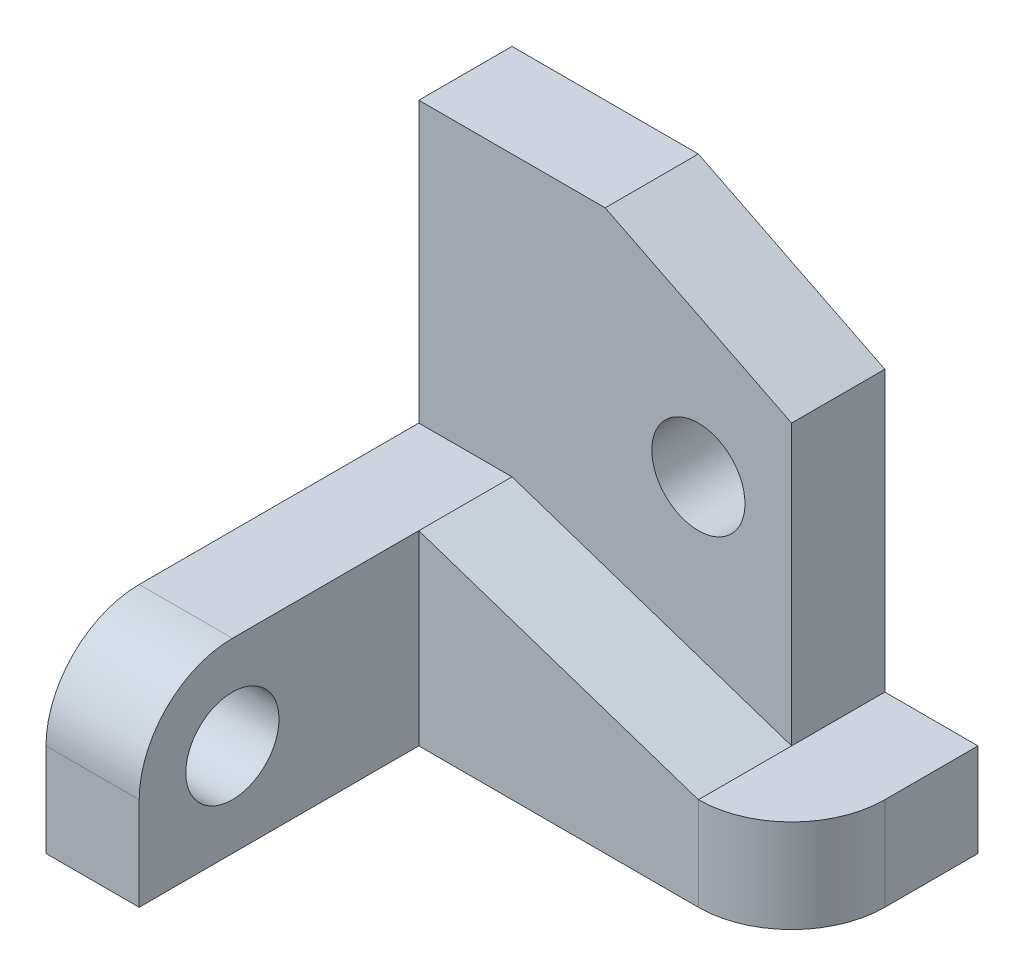
ISO-10303-21;
HEADER;
FILE_DESCRIPTION(('STEP AP214'),'2;1');
FILE_NAME('part.step','',(''),(''),'','','');
FILE_SCHEMA(('AUTOMOTIVE_DESIGN { 1 0 10303 214 1 1 1 1 }'));
ENDSEC;
DATA;
#1=APPLICATION_CONTEXT('core data for automotive mechanical design processes');
#2=APPLICATION_PROTOCOL_DEFINITION('international standard','automotive_design',2000,#1);
#3=PRODUCT_CONTEXT('',#1,'mechanical');
#4=PRODUCT('Part','Part','',(#3));
#5=PRODUCT_RELATED_PRODUCT_CATEGORY('part','',(#4));
#6=PRODUCT_DEFINITION_FORMATION('','',#4);
#7=PRODUCT_DEFINITION_CONTEXT('part definition',#1,'design');
#8=PRODUCT_DEFINITION('design','',#6,#7);
#9=PRODUCT_DEFINITION_SHAPE('','',#8);
#10=(LENGTH_UNIT() NAMED_UNIT(*) SI_UNIT(.MILLI.,.METRE.));
#11=(NAMED_UNIT(*) PLANE_ANGLE_UNIT() SI_UNIT($,.RADIAN.));
#12=(NAMED_UNIT(*) SI_UNIT($,.STERADIAN.) SOLID_ANGLE_UNIT());
#13=UNCERTAINTY_MEASURE_WITH_UNIT(LENGTH_MEASURE(1.E-05),#10,'distance_accuracy_value','');
#14=(GEOMETRIC_REPRESENTATION_CONTEXT(3) GLOBAL_UNCERTAINTY_ASSIGNED_CONTEXT((#13)) GLOBAL_UNIT_ASSIGNED_CONTEXT((#10,
#11,#12)) REPRESENTATION_CONTEXT('',''));
#15=CARTESIAN_POINT('',(0.,0.,0.));
#16=DIRECTION('',(0.,0.,1.));
#17=DIRECTION('',(1.,0.,0.));
#18=AXIS2_PLACEMENT_3D('',#15,#16,#17);
#19=CARTESIAN_POINT('',(0.,0.,5.));
#20=DIRECTION('',(-1.,0.,0.));
#21=DIRECTION('',(0.,-1.,0.));
#22=AXIS2_PLACEMENT_3D('',#19,#20,#21);
#23=PLANE('',#22);
#24=DIRECTION('',(0.,0.,1.));
#25=VECTOR('',#24,1.);
#26=CARTESIAN_POINT('',(0.,5.,-7.07106781186548));
#27=LINE('',#26,#25);
#28=CARTESIAN_POINT('',(0.,5.,0.));
#29=VERTEX_POINT('',#28);
#30=CARTESIAN_POINT('',(0.,5.,5.));
#31=VERTEX_POINT('',#30);
#32=EDGE_CURVE('E123',#29,#31,#27,.T.);
#33=ORIENTED_EDGE('',*,*,#32,.F.);
#34=DIRECTION('',(0.,1.,0.));
#35=VECTOR('',#34,1.);
#36=CARTESIAN_POINT('',(0.,0.,0.));
#37=LINE('',#36,#35);
#38=CARTESIAN_POINT('',(0.,20.0000000000001,0.));
#39=VERTEX_POINT('',#38);
#40=EDGE_CURVE('E172',#29,#39,#37,.T.);
#41=ORIENTED_EDGE('',*,*,#40,.T.);
#42=DIRECTION('',(0.,0.,-1.));
#43=VECTOR('',#42,1.);
#44=CARTESIAN_POINT('',(0.,20.0000000000001,5.));
#45=LINE('',#44,#43);
#46=CARTESIAN_POINT('',(0.,20.0000000000001,5.));
#47=VERTEX_POINT('',#46);
#48=EDGE_CURVE('E153',#47,#39,#45,.T.);
#49=ORIENTED_EDGE('',*,*,#48,.F.);
#50=DIRECTION('',(0.,1.,0.));
#51=VECTOR('',#50,1.);
#52=CARTESIAN_POINT('',(0.,0.,5.));
#53=LINE('',#52,#51);
#54=EDGE_CURVE('E141',#31,#47,#53,.T.);
#55=ORIENTED_EDGE('',*,*,#54,.F.);
#56=EDGE_LOOP('',(#33,#41,#49,#55));
#57=FACE_BOUND('',#56,.T.);
#58=ADVANCED_FACE('F35',(#57),#23,.F.);
#59=CARTESIAN_POINT('',(0.,0.,5.));
#60=DIRECTION('',(0.,0.,1.));
#61=DIRECTION('',(1.,0.,0.));
#62=AXIS2_PLACEMENT_3D('',#59,#60,#61);
#63=PLANE('',#62);
#64=DIRECTION('',(-1.,0.,0.));
#65=VECTOR('',#64,1.);
#66=CARTESIAN_POINT('',(7.3606797749979,10.,5.));
#67=LINE('',#66,#65);
#68=CARTESIAN_POINT('',(-15.,10.,5.));
#69=VERTEX_POINT('',#68);
#70=CARTESIAN_POINT('',(-20.,10.,5.));
#71=VERTEX_POINT('',#70);
#72=EDGE_CURVE('E145',#69,#71,#67,.T.);
#73=ORIENTED_EDGE('',*,*,#72,.F.);
#74=DIRECTION('',(-0.948683298050514,0.316227766016838,0.));
#75=VECTOR('',#74,1.);
#76=CARTESIAN_POINT('',(-15.,10.,5.));
#77=LINE('',#76,#75);
#78=EDGE_CURVE('E138',#31,#69,#77,.T.);
#79=ORIENTED_EDGE('',*,*,#78,.F.);
#80=ORIENTED_EDGE('',*,*,#54,.T.);
#81=DIRECTION('',(-0.89442719099992,0.447213595499949,0.));
#82=VECTOR('',#81,1.);
#83=CARTESIAN_POINT('',(-10.,25.,5.));
#84=LINE('',#83,#82);
#85=CARTESIAN_POINT('',(-10.,25.,5.));
#86=VERTEX_POINT('',#85);
#87=EDGE_CURVE('E154',#47,#86,#84,.T.);
#88=ORIENTED_EDGE('',*,*,#87,.T.);
#89=DIRECTION('',(-1.,0.,0.));
#90=VECTOR('',#89,1.);
#91=CARTESIAN_POINT('',(-10.,25.,5.));
#92=LINE('',#91,#90);
#93=CARTESIAN_POINT('',(-20.,25.,5.));
#94=VERTEX_POINT('',#93);
#95=EDGE_CURVE('E176',#86,#94,#92,.T.);
#96=ORIENTED_EDGE('',*,*,#95,.T.);
#97=DIRECTION('',(0.,-1.,0.));
#98=VECTOR('',#97,1.);
#99=CARTESIAN_POINT('',(-20.,0.,5.));
#100=LINE('',#99,#98);
#101=EDGE_CURVE('E178',#94,#71,#100,.T.);
#102=ORIENTED_EDGE('',*,*,#101,.T.);
#103=EDGE_LOOP('',(#73,#79,#80,#88,#96,#102));
#104=FACE_BOUND('',#103,.T.);
#105=CARTESIAN_POINT('',(-5.,15.,5.));
#106=DIRECTION('',(0.,0.,1.));
#107=DIRECTION('',(1.,0.,0.));
#108=AXIS2_PLACEMENT_3D('',#105,#106,#107);
#109=CIRCLE('',#108,2.5);
#110=CARTESIAN_POINT('',(-2.5,15.,5.));
#111=VERTEX_POINT('',#110);
#112=EDGE_CURVE('E169',#111,#111,#109,.T.);
#113=ORIENTED_EDGE('',*,*,#112,.F.);
#114=EDGE_LOOP('',(#113));
#115=FACE_BOUND('',#114,.T.);
#116=ADVANCED_FACE('F139',(#104,#115),#63,.T.);
#117=CARTESIAN_POINT('',(0.,0.,0.));
#118=DIRECTION('',(0.,0.,1.));
#119=DIRECTION('',(1.,0.,0.));
#120=AXIS2_PLACEMENT_3D('',#117,#118,#119);
#121=PLANE('',#120);
#122=ORIENTED_EDGE('',*,*,#40,.F.);
#123=DIRECTION('',(-1.,0.,0.));
#124=VECTOR('',#123,1.);
#125=CARTESIAN_POINT('',(0.,5.,0.));
#126=LINE('',#125,#124);
#127=CARTESIAN_POINT('',(5.,5.,0.));
#128=VERTEX_POINT('',#127);
#129=EDGE_CURVE('E130',#128,#29,#126,.T.);
#130=ORIENTED_EDGE('',*,*,#129,.F.);
#131=DIRECTION('',(0.,1.,0.));
#132=VECTOR('',#131,1.);
#133=CARTESIAN_POINT('',(5.,5.,0.));
#134=LINE('',#133,#132);
#135=CARTESIAN_POINT('',(5.,0.,0.));
#136=VERTEX_POINT('',#135);
#137=EDGE_CURVE('E226',#136,#128,#134,.T.);
#138=ORIENTED_EDGE('',*,*,#137,.F.);
#139=DIRECTION('',(1.,0.,0.));
#140=VECTOR('',#139,1.);
#141=CARTESIAN_POINT('',(0.,0.,0.));
#142=LINE('',#141,#140);
#143=CARTESIAN_POINT('',(-20.,0.,0.));
#144=VERTEX_POINT('',#143);
#145=EDGE_CURVE('E155',#144,#136,#142,.T.);
#146=ORIENTED_EDGE('',*,*,#145,.F.);
#147=DIRECTION('',(0.,-1.,0.));
#148=VECTOR('',#147,1.);
#149=CARTESIAN_POINT('',(-20.,0.,0.));
#150=LINE('',#149,#148);
#151=CARTESIAN_POINT('',(-20.,25.,0.));
#152=VERTEX_POINT('',#151);
#153=EDGE_CURVE('E186',#152,#144,#150,.T.);
#154=ORIENTED_EDGE('',*,*,#153,.F.);
#155=DIRECTION('',(-1.,0.,0.));
#156=VECTOR('',#155,1.);
#157=CARTESIAN_POINT('',(-10.,25.,0.));
#158=LINE('',#157,#156);
#159=CARTESIAN_POINT('',(-10.,25.,0.));
#160=VERTEX_POINT('',#159);
#161=EDGE_CURVE('E184',#160,#152,#158,.T.);
#162=ORIENTED_EDGE('',*,*,#161,.F.);
#163=DIRECTION('',(-0.89442719099992,0.447213595499949,0.));
#164=VECTOR('',#163,1.);
#165=CARTESIAN_POINT('',(-10.,25.,0.));
#166=LINE('',#165,#164);
#167=EDGE_CURVE('E182',#39,#160,#166,.T.);
#168=ORIENTED_EDGE('',*,*,#167,.F.);
#169=EDGE_LOOP('',(#122,#130,#138,#146,#154,#162,#168));
#170=FACE_BOUND('',#169,.T.);
#171=CARTESIAN_POINT('',(-5.,15.,0.));
#172=DIRECTION('',(0.,0.,1.));
#173=DIRECTION('',(1.,0.,0.));
#174=AXIS2_PLACEMENT_3D('',#171,#172,#173);
#175=CIRCLE('',#174,2.5);
#176=CARTESIAN_POINT('',(-2.5,15.,0.));
#177=VERTEX_POINT('',#176);
#178=EDGE_CURVE('E168',#177,#177,#175,.T.);
#179=ORIENTED_EDGE('',*,*,#178,.T.);
#180=EDGE_LOOP('',(#179));
#181=FACE_BOUND('',#180,.T.);
#182=ADVANCED_FACE('F273',(#170,#181),#121,.F.);
#183=CARTESIAN_POINT('',(-10.,25.,5.));
#184=DIRECTION('',(-0.447213595499949,-0.89442719099992,0.));
#185=DIRECTION('',(0.89442719099992,-0.447213595499949,0.));
#186=AXIS2_PLACEMENT_3D('',#183,#184,#185);
#187=PLANE('',#186);
#188=ORIENTED_EDGE('',*,*,#167,.T.);
#189=DIRECTION('',(0.,0.,-1.));
#190=VECTOR('',#189,1.);
#191=CARTESIAN_POINT('',(-10.,25.,5.));
#192=LINE('',#191,#190);
#193=EDGE_CURVE('E195',#86,#160,#192,.T.);
#194=ORIENTED_EDGE('',*,*,#193,.F.);
#195=ORIENTED_EDGE('',*,*,#87,.F.);
#196=ORIENTED_EDGE('',*,*,#48,.T.);
#197=EDGE_LOOP('',(#188,#194,#195,#196));
#198=FACE_BOUND('',#197,.T.);
#199=ADVANCED_FACE('F281',(#198),#187,.F.);
#200=CARTESIAN_POINT('',(-10.,25.,5.));
#201=DIRECTION('',(0.,-1.,0.));
#202=DIRECTION('',(1.,0.,0.));
#203=AXIS2_PLACEMENT_3D('',#200,#201,#202);
#204=PLANE('',#203);
#205=ORIENTED_EDGE('',*,*,#161,.T.);
#206=DIRECTION('',(0.,0.,-1.));
#207=VECTOR('',#206,1.);
#208=CARTESIAN_POINT('',(-20.,25.,5.));
#209=LINE('',#208,#207);
#210=EDGE_CURVE('E192',#94,#152,#209,.T.);
#211=ORIENTED_EDGE('',*,*,#210,.F.);
#212=ORIENTED_EDGE('',*,*,#95,.F.);
#213=ORIENTED_EDGE('',*,*,#193,.T.);
#214=EDGE_LOOP('',(#205,#211,#212,#213));
#215=FACE_BOUND('',#214,.T.);
#216=ADVANCED_FACE('F277',(#215),#204,.F.);
#217=CARTESIAN_POINT('',(-20.,0.,5.));
#218=DIRECTION('',(1.,0.,0.));
#219=DIRECTION('',(0.,0.,-1.));
#220=AXIS2_PLACEMENT_3D('',#217,#218,#219);
#221=PLANE('',#220);
#222=DIRECTION('',(0.,1.,0.));
#223=VECTOR('',#222,1.);
#224=CARTESIAN_POINT('',(-20.,0.,25.));
#225=LINE('',#224,#223);
#226=CARTESIAN_POINT('',(-20.,0.,25.));
#227=VERTEX_POINT('',#226);
#228=CARTESIAN_POINT('',(-20.,5.,25.));
#229=VERTEX_POINT('',#228);
#230=EDGE_CURVE('E235',#227,#229,#225,.T.);
#231=ORIENTED_EDGE('',*,*,#230,.T.);
#232=CARTESIAN_POINT('',(-20.,5.,20.));
#233=DIRECTION('',(1.,0.,0.));
#234=DIRECTION('',(0.,0.,-1.));
#235=AXIS2_PLACEMENT_3D('',#232,#233,#234);
#236=CIRCLE('',#235,5.);
#237=CARTESIAN_POINT('',(-20.,10.,20.));
#238=VERTEX_POINT('',#237);
#239=EDGE_CURVE('E202',#229,#238,#236,.F.);
#240=ORIENTED_EDGE('',*,*,#239,.T.);
#241=DIRECTION('',(0.,0.,-1.));
#242=VECTOR('',#241,1.);
#243=CARTESIAN_POINT('',(-20.,10.,5.));
#244=LINE('',#243,#242);
#245=EDGE_CURVE('E233',#238,#71,#244,.T.);
#246=ORIENTED_EDGE('',*,*,#245,.T.);
#247=ORIENTED_EDGE('',*,*,#101,.F.);
#248=ORIENTED_EDGE('',*,*,#210,.T.);
#249=ORIENTED_EDGE('',*,*,#153,.T.);
#250=DIRECTION('',(0.,0.,-1.));
#251=VECTOR('',#250,1.);
#252=CARTESIAN_POINT('',(-20.,0.,5.));
#253=LINE('',#252,#251);
#254=EDGE_CURVE('E180',#227,#144,#253,.T.);
#255=ORIENTED_EDGE('',*,*,#254,.F.);
#256=EDGE_LOOP('',(#231,#240,#246,#247,#248,#249,#255));
#257=FACE_BOUND('',#256,.T.);
#258=CARTESIAN_POINT('',(-20.,5.,20.));
#259=DIRECTION('',(-1.,0.,0.));
#260=DIRECTION('',(0.,0.,1.));
#261=AXIS2_PLACEMENT_3D('',#258,#259,#260);
#262=CIRCLE('',#261,2.5);
#263=CARTESIAN_POINT('',(-20.,5.,22.5));
#264=VERTEX_POINT('',#263);
#265=EDGE_CURVE('E238',#264,#264,#262,.T.);
#266=ORIENTED_EDGE('',*,*,#265,.F.);
#267=EDGE_LOOP('',(#266));
#268=FACE_BOUND('',#267,.T.);
#269=ADVANCED_FACE('F266',(#257,#268),#221,.F.);
#270=CARTESIAN_POINT('',(0.,0.,5.));
#271=DIRECTION('',(0.,1.,0.));
#272=DIRECTION('',(-1.,0.,0.));
#273=AXIS2_PLACEMENT_3D('',#270,#271,#272);
#274=PLANE('',#273);
#275=DIRECTION('',(0.,0.,-1.));
#276=VECTOR('',#275,1.);
#277=CARTESIAN_POINT('',(5.,0.,10.));
#278=LINE('',#277,#276);
#279=CARTESIAN_POINT('',(5.,0.,5.));
#280=VERTEX_POINT('',#279);
#281=EDGE_CURVE('E163',#280,#136,#278,.T.);
#282=ORIENTED_EDGE('',*,*,#281,.F.);
#283=CARTESIAN_POINT('',(0.,0.,5.));
#284=DIRECTION('',(0.,1.,0.));
#285=DIRECTION('',(-1.,0.,0.));
#286=AXIS2_PLACEMENT_3D('',#283,#284,#285);
#287=CIRCLE('',#286,5.);
#288=CARTESIAN_POINT('',(0.,0.,10.));
#289=VERTEX_POINT('',#288);
#290=EDGE_CURVE('E11',#280,#289,#287,.F.);
#291=ORIENTED_EDGE('',*,*,#290,.T.);
#292=DIRECTION('',(1.,0.,0.));
#293=VECTOR('',#292,1.);
#294=CARTESIAN_POINT('',(5.,0.,10.));
#295=LINE('',#294,#293);
#296=CARTESIAN_POINT('',(-15.,0.,10.));
#297=VERTEX_POINT('',#296);
#298=EDGE_CURVE('E217',#297,#289,#295,.T.);
#299=ORIENTED_EDGE('',*,*,#298,.F.);
#300=DIRECTION('',(0.,0.,1.));
#301=VECTOR('',#300,1.);
#302=CARTESIAN_POINT('',(-15.,0.,5.));
#303=LINE('',#302,#301);
#304=CARTESIAN_POINT('',(-15.,0.,25.));
#305=VERTEX_POINT('',#304);
#306=EDGE_CURVE('E244',#297,#305,#303,.T.);
#307=ORIENTED_EDGE('',*,*,#306,.T.);
#308=DIRECTION('',(-1.,0.,0.));
#309=VECTOR('',#308,1.);
#310=CARTESIAN_POINT('',(7.3606797749979,0.,25.));
#311=LINE('',#310,#309);
#312=EDGE_CURVE('E241',#305,#227,#311,.T.);
#313=ORIENTED_EDGE('',*,*,#312,.T.);
#314=ORIENTED_EDGE('',*,*,#254,.T.);
#315=ORIENTED_EDGE('',*,*,#145,.T.);
#316=EDGE_LOOP('',(#282,#291,#299,#307,#313,#314,#315));
#317=FACE_BOUND('',#316,.T.);
#318=ADVANCED_FACE('F221',(#317),#274,.F.);
#319=CARTESIAN_POINT('',(-5.,15.,5.));
#320=DIRECTION('',(0.,0.,-1.));
#321=DIRECTION('',(-1.,0.,0.));
#322=AXIS2_PLACEMENT_3D('',#319,#320,#321);
#323=CYLINDRICAL_SURFACE('',#322,2.5);
#324=ORIENTED_EDGE('',*,*,#112,.T.);
#325=EDGE_LOOP('',(#324));
#326=FACE_BOUND('',#325,.T.);
#327=ORIENTED_EDGE('',*,*,#178,.F.);
#328=EDGE_LOOP('',(#327));
#329=FACE_BOUND('',#328,.T.);
#330=ADVANCED_FACE('F310',(#326,#329),#323,.F.);
#331=CARTESIAN_POINT('',(5.,5.,10.));
#332=DIRECTION('',(-1.,0.,0.));
#333=DIRECTION('',(0.,0.,1.));
#334=AXIS2_PLACEMENT_3D('',#331,#332,#333);
#335=PLANE('',#334);
#336=DIRECTION('',(0.,0.,-1.));
#337=VECTOR('',#336,1.);
#338=CARTESIAN_POINT('',(5.,5.,10.));
#339=LINE('',#338,#337);
#340=CARTESIAN_POINT('',(5.,5.,5.));
#341=VERTEX_POINT('',#340);
#342=EDGE_CURVE('E160',#341,#128,#339,.T.);
#343=ORIENTED_EDGE('',*,*,#342,.F.);
#344=DIRECTION('',(0.,1.,0.));
#345=VECTOR('',#344,1.);
#346=CARTESIAN_POINT('',(5.,5.,5.));
#347=LINE('',#346,#345);
#348=EDGE_CURVE('E43',#341,#280,#347,.F.);
#349=ORIENTED_EDGE('',*,*,#348,.T.);
#350=ORIENTED_EDGE('',*,*,#281,.T.);
#351=ORIENTED_EDGE('',*,*,#137,.T.);
#352=EDGE_LOOP('',(#343,#349,#350,#351));
#353=FACE_BOUND('',#352,.T.);
#354=ADVANCED_FACE('F225',(#353),#335,.F.);
#355=CARTESIAN_POINT('',(0.,5.,10.));
#356=DIRECTION('',(0.,-1.,0.));
#357=DIRECTION('',(0.,0.,-1.));
#358=AXIS2_PLACEMENT_3D('',#355,#356,#357);
#359=PLANE('',#358);
#360=DIRECTION('',(0.,0.,-1.));
#361=VECTOR('',#360,1.);
#362=CARTESIAN_POINT('',(0.,5.,10.));
#363=LINE('',#362,#361);
#364=CARTESIAN_POINT('',(0.,5.,10.));
#365=VERTEX_POINT('',#364);
#366=EDGE_CURVE('E127',#365,#31,#363,.T.);
#367=ORIENTED_EDGE('',*,*,#366,.F.);
#368=CARTESIAN_POINT('',(0.,5.,5.));
#369=DIRECTION('',(0.,-1.,0.));
#370=DIRECTION('',(0.,0.,-1.));
#371=AXIS2_PLACEMENT_3D('',#368,#369,#370);
#372=CIRCLE('',#371,5.);
#373=EDGE_CURVE('E57',#365,#341,#372,.F.);
#374=ORIENTED_EDGE('',*,*,#373,.T.);
#375=ORIENTED_EDGE('',*,*,#342,.T.);
#376=ORIENTED_EDGE('',*,*,#129,.T.);
#377=ORIENTED_EDGE('',*,*,#32,.T.);
#378=EDGE_LOOP('',(#367,#374,#375,#376,#377));
#379=FACE_BOUND('',#378,.T.);
#380=ADVANCED_FACE('F125',(#379),#359,.F.);
#381=CARTESIAN_POINT('',(-15.,10.,10.));
#382=DIRECTION('',(-0.316227766016838,-0.948683298050514,0.));
#383=DIRECTION('',(0.948683298050514,-0.316227766016838,0.));
#384=AXIS2_PLACEMENT_3D('',#381,#382,#383);
#385=PLANE('',#384);
#386=ORIENTED_EDGE('',*,*,#78,.T.);
#387=DIRECTION('',(0.,0.,-1.));
#388=VECTOR('',#387,1.);
#389=CARTESIAN_POINT('',(-15.,10.,10.));
#390=LINE('',#389,#388);
#391=CARTESIAN_POINT('',(-15.,10.,10.));
#392=VERTEX_POINT('',#391);
#393=EDGE_CURVE('E161',#392,#69,#390,.T.);
#394=ORIENTED_EDGE('',*,*,#393,.F.);
#395=DIRECTION('',(-0.948683298050514,0.316227766016838,0.));
#396=VECTOR('',#395,1.);
#397=CARTESIAN_POINT('',(-15.,10.,10.));
#398=LINE('',#397,#396);
#399=EDGE_CURVE('E159',#365,#392,#398,.T.);
#400=ORIENTED_EDGE('',*,*,#399,.F.);
#401=ORIENTED_EDGE('',*,*,#366,.T.);
#402=EDGE_LOOP('',(#386,#394,#400,#401));
#403=FACE_BOUND('',#402,.T.);
#404=ADVANCED_FACE('F157',(#403),#385,.F.);
#405=CARTESIAN_POINT('',(0.,0.,10.));
#406=DIRECTION('',(0.,0.,-1.));
#407=DIRECTION('',(-1.,0.,0.));
#408=AXIS2_PLACEMENT_3D('',#405,#406,#407);
#409=PLANE('',#408);
#410=ORIENTED_EDGE('',*,*,#298,.T.);
#411=DIRECTION('',(0.,1.,0.));
#412=VECTOR('',#411,1.);
#413=CARTESIAN_POINT('',(0.,0.,10.));
#414=LINE('',#413,#412);
#415=EDGE_CURVE('E208',#289,#365,#414,.T.);
#416=ORIENTED_EDGE('',*,*,#415,.T.);
#417=ORIENTED_EDGE('',*,*,#399,.T.);
#418=DIRECTION('',(0.,-1.,0.));
#419=VECTOR('',#418,1.);
#420=CARTESIAN_POINT('',(-15.,0.,10.));
#421=LINE('',#420,#419);
#422=EDGE_CURVE('E148',#392,#297,#421,.T.);
#423=ORIENTED_EDGE('',*,*,#422,.T.);
#424=EDGE_LOOP('',(#410,#416,#417,#423));
#425=FACE_BOUND('',#424,.T.);
#426=ADVANCED_FACE('F214',(#425),#409,.F.);
#427=CARTESIAN_POINT('',(-15.,0.,10.));
#428=DIRECTION('',(1.,0.,0.));
#429=DIRECTION('',(0.,0.,-1.));
#430=AXIS2_PLACEMENT_3D('',#427,#428,#429);
#431=PLANE('',#430);
#432=CARTESIAN_POINT('',(-15.,5.,20.));
#433=DIRECTION('',(1.,0.,0.));
#434=DIRECTION('',(0.,0.,-1.));
#435=AXIS2_PLACEMENT_3D('',#432,#433,#434);
#436=CIRCLE('',#435,2.5);
#437=CARTESIAN_POINT('',(-15.,5.,17.5));
#438=VERTEX_POINT('',#437);
#439=EDGE_CURVE('E149',#438,#438,#436,.F.);
#440=ORIENTED_EDGE('',*,*,#439,.T.);
#441=EDGE_LOOP('',(#440));
#442=FACE_BOUND('',#441,.T.);
#443=DIRECTION('',(0.,0.,-1.));
#444=VECTOR('',#443,1.);
#445=CARTESIAN_POINT('',(-15.,10.,5.));
#446=LINE('',#445,#444);
#447=CARTESIAN_POINT('',(-15.,10.,20.));
#448=VERTEX_POINT('',#447);
#449=EDGE_CURVE('E228',#448,#392,#446,.T.);
#450=ORIENTED_EDGE('',*,*,#449,.F.);
#451=CARTESIAN_POINT('',(-15.,5.,20.));
#452=DIRECTION('',(1.,0.,0.));
#453=DIRECTION('',(0.,0.,-1.));
#454=AXIS2_PLACEMENT_3D('',#451,#452,#453);
#455=CIRCLE('',#454,5.);
#456=CARTESIAN_POINT('',(-15.,5.,25.));
#457=VERTEX_POINT('',#456);
#458=EDGE_CURVE('E206',#448,#457,#455,.T.);
#459=ORIENTED_EDGE('',*,*,#458,.T.);
#460=DIRECTION('',(0.,1.,0.));
#461=VECTOR('',#460,1.);
#462=CARTESIAN_POINT('',(-15.,0.,25.));
#463=LINE('',#462,#461);
#464=EDGE_CURVE('E245',#305,#457,#463,.T.);
#465=ORIENTED_EDGE('',*,*,#464,.F.);
#466=ORIENTED_EDGE('',*,*,#306,.F.);
#467=ORIENTED_EDGE('',*,*,#422,.F.);
#468=EDGE_LOOP('',(#450,#459,#465,#466,#467));
#469=FACE_BOUND('',#468,.T.);
#470=ADVANCED_FACE('F257',(#442,#469),#431,.T.);
#471=CARTESIAN_POINT('',(7.3606797749979,10.,5.));
#472=DIRECTION('',(0.,1.,0.));
#473=DIRECTION('',(0.,0.,1.));
#474=AXIS2_PLACEMENT_3D('',#471,#472,#473);
#475=PLANE('',#474);
#476=ORIENTED_EDGE('',*,*,#245,.F.);
#477=DIRECTION('',(-1.,0.,0.));
#478=VECTOR('',#477,1.);
#479=CARTESIAN_POINT('',(7.3606797749979,10.,20.));
#480=LINE('',#479,#478);
#481=EDGE_CURVE('E204',#238,#448,#480,.F.);
#482=ORIENTED_EDGE('',*,*,#481,.T.);
#483=ORIENTED_EDGE('',*,*,#449,.T.);
#484=ORIENTED_EDGE('',*,*,#393,.T.);
#485=ORIENTED_EDGE('',*,*,#72,.T.);
#486=EDGE_LOOP('',(#476,#482,#483,#484,#485));
#487=FACE_BOUND('',#486,.T.);
#488=ADVANCED_FACE('F284',(#487),#475,.T.);
#489=CARTESIAN_POINT('',(7.3606797749979,0.,25.));
#490=DIRECTION('',(0.,0.,1.));
#491=DIRECTION('',(1.,0.,0.));
#492=AXIS2_PLACEMENT_3D('',#489,#490,#491);
#493=PLANE('',#492);
#494=ORIENTED_EDGE('',*,*,#464,.T.);
#495=DIRECTION('',(-1.,0.,0.));
#496=VECTOR('',#495,1.);
#497=CARTESIAN_POINT('',(7.3606797749979,5.,25.));
#498=LINE('',#497,#496);
#499=EDGE_CURVE('E199',#457,#229,#498,.T.);
#500=ORIENTED_EDGE('',*,*,#499,.T.);
#501=ORIENTED_EDGE('',*,*,#230,.F.);
#502=ORIENTED_EDGE('',*,*,#312,.F.);
#503=EDGE_LOOP('',(#494,#500,#501,#502));
#504=FACE_BOUND('',#503,.T.);
#505=ADVANCED_FACE('F263',(#504),#493,.T.);
#506=CARTESIAN_POINT('',(7.3606797749979,5.,20.));
#507=DIRECTION('',(-1.,0.,0.));
#508=DIRECTION('',(0.,0.,1.));
#509=AXIS2_PLACEMENT_3D('',#506,#507,#508);
#510=CYLINDRICAL_SURFACE('',#509,2.5);
#511=ORIENTED_EDGE('',*,*,#265,.T.);
#512=EDGE_LOOP('',(#511));
#513=FACE_BOUND('',#512,.T.);
#514=ORIENTED_EDGE('',*,*,#439,.F.);
#515=EDGE_LOOP('',(#514));
#516=FACE_BOUND('',#515,.T.);
#517=ADVANCED_FACE('F288',(#513,#516),#510,.F.);
#518=CARTESIAN_POINT('',(7.3606797749979,5.,20.));
#519=DIRECTION('',(-1.,0.,0.));
#520=DIRECTION('',(0.,0.,1.));
#521=AXIS2_PLACEMENT_3D('',#518,#519,#520);
#522=CYLINDRICAL_SURFACE('',#521,5.);
#523=ORIENTED_EDGE('',*,*,#458,.F.);
#524=ORIENTED_EDGE('',*,*,#481,.F.);
#525=ORIENTED_EDGE('',*,*,#239,.F.);
#526=ORIENTED_EDGE('',*,*,#499,.F.);
#527=EDGE_LOOP('',(#523,#524,#525,#526));
#528=FACE_BOUND('',#527,.T.);
#529=ADVANCED_FACE('F286',(#528),#522,.T.);
#530=CARTESIAN_POINT('',(0.,0.,5.));
#531=DIRECTION('',(0.,1.,0.));
#532=DIRECTION('',(0.,0.,1.));
#533=AXIS2_PLACEMENT_3D('',#530,#531,#532);
#534=CYLINDRICAL_SURFACE('',#533,5.);
#535=ORIENTED_EDGE('',*,*,#290,.F.);
#536=ORIENTED_EDGE('',*,*,#348,.F.);
#537=ORIENTED_EDGE('',*,*,#373,.F.);
#538=ORIENTED_EDGE('',*,*,#415,.F.);
#539=EDGE_LOOP('',(#535,#536,#537,#538));
#540=FACE_BOUND('',#539,.T.);
#541=ADVANCED_FACE('F37',(#540),#534,.T.);
#542=CLOSED_SHELL('',(#58,#116,#182,#199,#216,#269,#318,#330,#354,#380,#404,#426,#470,#488,#505,
#517,#529,#541));
#543=MANIFOLD_SOLID_BREP('B2',#542);
#544=ADVANCED_BREP_SHAPE_REPRESENTATION('',(#18,#543),#14);
#545=SHAPE_DEFINITION_REPRESENTATION(#9,#544);
ENDSEC;
END-ISO-10303-21;
